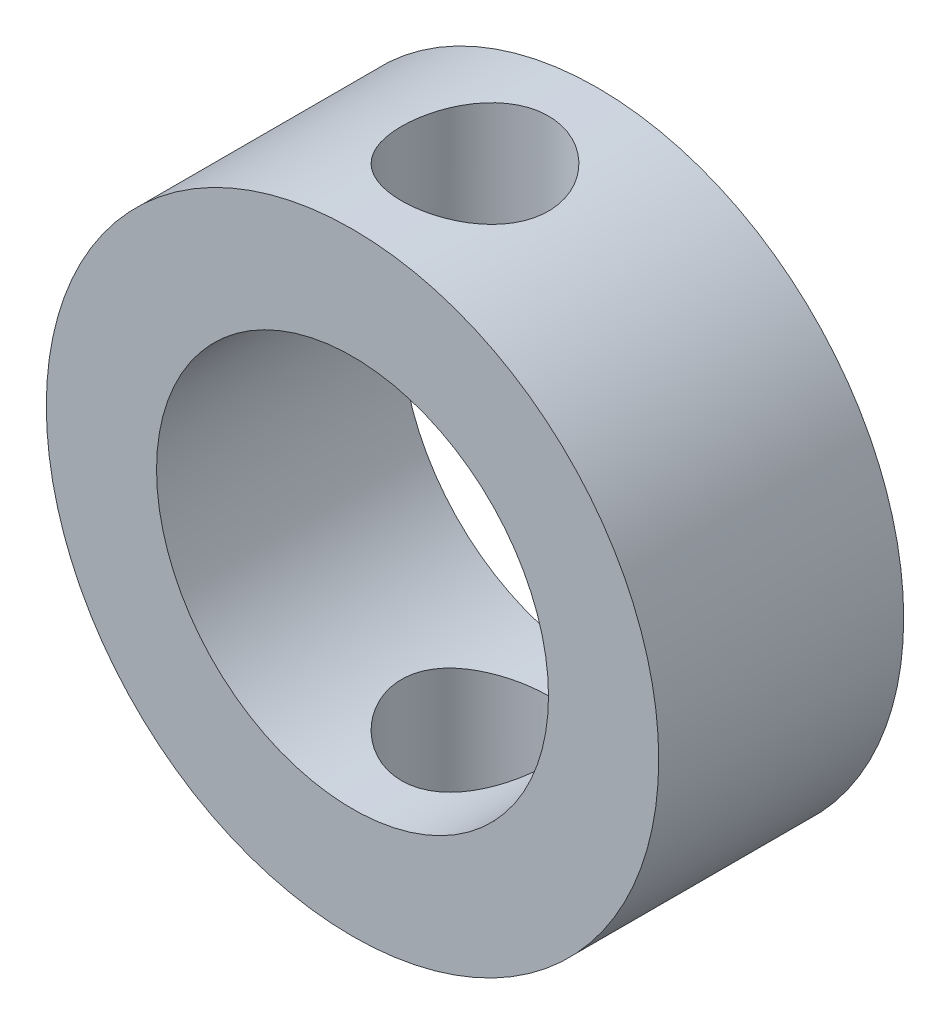
ISO-10303-21;
HEADER;
FILE_DESCRIPTION(('STEP AP214'),'2;1');
FILE_NAME('part.step','',(''),(''),'','','');
FILE_SCHEMA(('AUTOMOTIVE_DESIGN { 1 0 10303 214 1 1 1 1 }'));
ENDSEC;
DATA;
#1=APPLICATION_CONTEXT('core data for automotive mechanical design processes');
#2=APPLICATION_PROTOCOL_DEFINITION('international standard','automotive_design',2000,#1);
#3=PRODUCT_CONTEXT('',#1,'mechanical');
#4=PRODUCT('Part','Part','',(#3));
#5=PRODUCT_RELATED_PRODUCT_CATEGORY('part','',(#4));
#6=PRODUCT_DEFINITION_FORMATION('','',#4);
#7=PRODUCT_DEFINITION_CONTEXT('part definition',#1,'design');
#8=PRODUCT_DEFINITION('design','',#6,#7);
#9=PRODUCT_DEFINITION_SHAPE('','',#8);
#10=(LENGTH_UNIT() NAMED_UNIT(*) SI_UNIT(.MILLI.,.METRE.));
#11=(NAMED_UNIT(*) PLANE_ANGLE_UNIT() SI_UNIT($,.RADIAN.));
#12=(NAMED_UNIT(*) SI_UNIT($,.STERADIAN.) SOLID_ANGLE_UNIT());
#13=UNCERTAINTY_MEASURE_WITH_UNIT(LENGTH_MEASURE(1.E-05),#10,'distance_accuracy_value','');
#14=(GEOMETRIC_REPRESENTATION_CONTEXT(3) GLOBAL_UNCERTAINTY_ASSIGNED_CONTEXT((#13)) GLOBAL_UNIT_ASSIGNED_CONTEXT((#10,
#11,#12)) REPRESENTATION_CONTEXT('',''));
#15=CARTESIAN_POINT('',(0.,0.,0.));
#16=DIRECTION('',(0.,0.,1.));
#17=DIRECTION('',(1.,0.,0.));
#18=AXIS2_PLACEMENT_3D('',#15,#16,#17);
#19=CARTESIAN_POINT('',(0.,0.,5.));
#20=DIRECTION('',(0.,0.,1.));
#21=DIRECTION('',(1.,0.,0.));
#22=AXIS2_PLACEMENT_3D('',#19,#20,#21);
#23=PLANE('',#22);
#24=CARTESIAN_POINT('',(0.,0.,5.));
#25=DIRECTION('',(0.,0.,1.));
#26=DIRECTION('',(1.,0.,0.));
#27=AXIS2_PLACEMENT_3D('',#24,#25,#26);
#28=CIRCLE('',#27,12.5);
#29=CARTESIAN_POINT('',(12.5,0.,5.));
#30=VERTEX_POINT('',#29);
#31=EDGE_CURVE('E10',#30,#30,#28,.T.);
#32=ORIENTED_EDGE('',*,*,#31,.T.);
#33=EDGE_LOOP('',(#32));
#34=FACE_BOUND('',#33,.T.);
#35=CARTESIAN_POINT('',(0.,0.,5.));
#36=DIRECTION('',(0.,0.,1.));
#37=DIRECTION('',(1.,0.,0.));
#38=AXIS2_PLACEMENT_3D('',#35,#36,#37);
#39=CIRCLE('',#38,8.);
#40=CARTESIAN_POINT('',(8.,0.,5.));
#41=VERTEX_POINT('',#40);
#42=EDGE_CURVE('E49',#41,#41,#39,.T.);
#43=ORIENTED_EDGE('',*,*,#42,.F.);
#44=EDGE_LOOP('',(#43));
#45=FACE_BOUND('',#44,.T.);
#46=ADVANCED_FACE('F31',(#34,#45),#23,.T.);
#47=CARTESIAN_POINT('',(0.,0.,-5.));
#48=DIRECTION('',(0.,0.,1.));
#49=DIRECTION('',(1.,0.,0.));
#50=AXIS2_PLACEMENT_3D('',#47,#48,#49);
#51=PLANE('',#50);
#52=CARTESIAN_POINT('',(0.,0.,-5.));
#53=DIRECTION('',(0.,0.,1.));
#54=DIRECTION('',(1.,0.,0.));
#55=AXIS2_PLACEMENT_3D('',#52,#53,#54);
#56=CIRCLE('',#55,12.5);
#57=CARTESIAN_POINT('',(12.5,0.,-5.));
#58=VERTEX_POINT('',#57);
#59=EDGE_CURVE('E44',#58,#58,#56,.T.);
#60=ORIENTED_EDGE('',*,*,#59,.F.);
#61=EDGE_LOOP('',(#60));
#62=FACE_BOUND('',#61,.T.);
#63=CARTESIAN_POINT('',(0.,0.,-5.));
#64=DIRECTION('',(0.,0.,1.));
#65=DIRECTION('',(1.,0.,0.));
#66=AXIS2_PLACEMENT_3D('',#63,#64,#65);
#67=CIRCLE('',#66,8.);
#68=CARTESIAN_POINT('',(8.,0.,-5.));
#69=VERTEX_POINT('',#68);
#70=EDGE_CURVE('E52',#69,#69,#67,.T.);
#71=ORIENTED_EDGE('',*,*,#70,.T.);
#72=EDGE_LOOP('',(#71));
#73=FACE_BOUND('',#72,.T.);
#74=ADVANCED_FACE('F85',(#62,#73),#51,.F.);
#75=CARTESIAN_POINT('',(0.,0.,5.));
#76=DIRECTION('',(0.,0.,-1.));
#77=DIRECTION('',(-1.,0.,0.));
#78=AXIS2_PLACEMENT_3D('',#75,#76,#77);
#79=CYLINDRICAL_SURFACE('',#78,12.5);
#80=CARTESIAN_POINT('',(0.,-12.5,3.));
#81=CARTESIAN_POINT('',(0.165963929028716,-12.4999970714968,2.99999497592273));
#82=CARTESIAN_POINT('',(0.331985420928068,-12.4966615634859,2.98618158976393));
#83=CARTESIAN_POINT('',(0.65928429097138,-12.4836783946933,2.93136726040462));
#84=CARTESIAN_POINT('',(0.820558683214275,-12.4740268462166,2.89034957200532));
#85=CARTESIAN_POINT('',(1.13358839471402,-12.4494823208195,2.78250766549564));
#86=CARTESIAN_POINT('',(1.28535442324822,-12.4345953702841,2.71571311014241));
#87=CARTESIAN_POINT('',(1.57552517879763,-12.4011725442513,2.55831456355411));
#88=CARTESIAN_POINT('',(1.71392971475166,-12.3826366165873,2.46771023192274));
#89=CARTESIAN_POINT('',(1.97609263393972,-12.3435386014785,2.26343582162447));
#90=CARTESIAN_POINT('',(2.0995595210048,-12.3229472454311,2.14939721895074));
#91=CARTESIAN_POINT('',(2.32581080811943,-12.2822574370147,1.90228113093536));
#92=CARTESIAN_POINT('',(2.42859304624489,-12.2621590363612,1.76920165795905));
#93=CARTESIAN_POINT('',(2.61189993555015,-12.224437969062,1.48555416698254));
#94=CARTESIAN_POINT('',(2.69210377047565,-12.2068525815312,1.33477341624115));
#95=CARTESIAN_POINT('',(2.82591582947333,-12.1765733412448,1.02138016487152));
#96=CARTESIAN_POINT('',(2.87952794169564,-12.1638787734309,0.858769397976845));
#97=CARTESIAN_POINT('',(2.95765058108663,-12.1451184675007,0.529523426731098));
#98=CARTESIAN_POINT('',(2.98268262400616,-12.1389341034343,0.363018878474493));
#99=CARTESIAN_POINT('',(3.00455808879087,-12.1335389605945,0.0280676203572428));
#100=CARTESIAN_POINT('',(3.00140571682399,-12.1343271412568,-0.140378795956921));
#101=CARTESIAN_POINT('',(2.96741912081942,-12.1426811387008,-0.470475966012881));
#102=CARTESIAN_POINT('',(2.93720103400494,-12.1500960921292,-0.632194565189556));
#103=CARTESIAN_POINT('',(2.85092141637189,-12.1706283738785,-0.948197316647835));
#104=CARTESIAN_POINT('',(2.79485817372027,-12.1837460799133,-1.10248097573443));
#105=CARTESIAN_POINT('',(2.65794121231782,-12.2143476734445,-1.40091297808436));
#106=CARTESIAN_POINT('',(2.5768594824696,-12.2318714325758,-1.54495245291669));
#107=CARTESIAN_POINT('',(2.39236688956383,-12.2692875046197,-1.81760450072258));
#108=CARTESIAN_POINT('',(2.28895240342647,-12.2891802016137,-1.94621456528511));
#109=CARTESIAN_POINT('',(2.05951493908847,-12.329732025739,-2.18789357031874));
#110=CARTESIAN_POINT('',(1.93297064389908,-12.3503975788014,-2.30046709906221));
#111=CARTESIAN_POINT('',(1.66255592459691,-12.3896951594929,-2.50288471974638));
#112=CARTESIAN_POINT('',(1.5186850498214,-12.4083271342049,-2.59272822029262));
#113=CARTESIAN_POINT('',(1.21702847718581,-12.4415394956922,-2.74729722061278));
#114=CARTESIAN_POINT('',(1.05920278696054,-12.4561077058019,-2.81194745623779));
#115=CARTESIAN_POINT('',(0.734497606078675,-12.4794620474154,-2.91366507904859));
#116=CARTESIAN_POINT('',(0.567619713387661,-12.4882491958651,-2.95073731762681));
#117=CARTESIAN_POINT('',(0.233787399651664,-12.4989027542709,-2.99550206465204));
#118=CARTESIAN_POINT('',(0.0669284805450077,-12.5009282130753,-3.00386989246157));
#119=CARTESIAN_POINT('',(-0.265804381586629,-12.4982807419474,-2.9928332331491));
#120=CARTESIAN_POINT('',(-0.431678404764953,-12.4936083648176,-2.97343103801277));
#121=CARTESIAN_POINT('',(-0.755422580108847,-12.4781916395217,-2.90796302148362));
#122=CARTESIAN_POINT('',(-0.913370579311303,-12.4675301590363,-2.8622608904262));
#123=CARTESIAN_POINT('',(-1.21935330013476,-12.4413335015664,-2.74590180830473));
#124=CARTESIAN_POINT('',(-1.3673870666415,-12.4257978558334,-2.67524245702189));
#125=CARTESIAN_POINT('',(-1.6520615099557,-12.3911910149582,-2.50963340640215));
#126=CARTESIAN_POINT('',(-1.78847176740355,-12.3720653178033,-2.41429928307563));
#127=CARTESIAN_POINT('',(-2.04359904096632,-12.3324936406987,-2.20254307098659));
#128=CARTESIAN_POINT('',(-2.16231325074337,-12.3120474520734,-2.08611764391922));
#129=CARTESIAN_POINT('',(-2.38142453789941,-12.2715742142771,-1.83235916879145));
#130=CARTESIAN_POINT('',(-2.4813497404737,-12.2515669262668,-1.6946148779179));
#131=CARTESIAN_POINT('',(-2.65666020824081,-12.2147538797452,-1.40390957210327));
#132=CARTESIAN_POINT('',(-2.7320465722335,-12.1979479778962,-1.25094923890653));
#133=CARTESIAN_POINT('',(-2.85558993518171,-12.1696189519335,-0.934987486456012));
#134=CARTESIAN_POINT('',(-2.90390754385905,-12.1580647463107,-0.772051796578772));
#135=CARTESIAN_POINT('',(-2.97238380283979,-12.1415072663683,-0.440053814979306));
#136=CARTESIAN_POINT('',(-2.99254804274991,-12.1365026916888,-0.270992746238225));
#137=CARTESIAN_POINT('',(-3.00387066449353,-12.1337046220624,0.0636707002806006));
#138=CARTESIAN_POINT('',(-2.99578106592266,-12.1357241633848,0.229246496326696));
#139=CARTESIAN_POINT('',(-2.95253345626267,-12.1463176460425,0.556599764223694));
#140=CARTESIAN_POINT('',(-2.91737590900096,-12.1548914750658,0.718377301111357));
#141=CARTESIAN_POINT('',(-2.82138591303537,-12.1775274976748,1.03279755254825));
#142=CARTESIAN_POINT('',(-2.76068402045612,-12.191561756094,1.18548227258375));
#143=CARTESIAN_POINT('',(-2.61543373580582,-12.2235433612686,1.47860441388369));
#144=CARTESIAN_POINT('',(-2.53088229934855,-12.2414912075257,1.61904026858636));
#145=CARTESIAN_POINT('',(-2.33793007708464,-12.279819325529,1.88733700011951));
#146=CARTESIAN_POINT('',(-2.22900267979018,-12.3002478697533,2.01481232309873));
#147=CARTESIAN_POINT('',(-1.99143074773236,-12.3409359831145,2.24991998805192));
#148=CARTESIAN_POINT('',(-1.86278158874234,-12.361195511444,2.35754766321024));
#149=CARTESIAN_POINT('',(-1.5868829988014,-12.3996570299581,2.55160925955475));
#150=CARTESIAN_POINT('',(-1.43936414359402,-12.4178200201219,2.637668405442));
#151=CARTESIAN_POINT('',(-1.13153622828567,-12.4496380610582,2.78362953274789));
#152=CARTESIAN_POINT('',(-0.97123697369122,-12.4632965272855,2.84355134339162));
#153=CARTESIAN_POINT('',(-0.675887025694765,-12.4824059901497,2.92603862513779));
#154=CARTESIAN_POINT('',(-0.542312066268421,-12.4889599449579,2.9537166157857));
#155=CARTESIAN_POINT('',(-0.272504227478248,-12.4977580149525,2.99069878085188));
#156=CARTESIAN_POINT('',(-0.136271517915776,-12.5000024045682,3.00000412522552));
#157=CARTESIAN_POINT('',(0.,-12.5,3.));
#158=B_SPLINE_CURVE_WITH_KNOTS('',3,(#80,#81,#82,#83,#84,#85,#86,#87,#88,#89,#90,#91,#92,#93,
#94,#95,#96,#97,#98,#99,#100,#101,#102,#103,#104,#105,#106,#107,#108,#109,#110,#111,#112,#113,
#114,#115,#116,#117,#118,#119,#120,#121,#122,#123,#124,#125,#126,#127,#128,#129,#130,#131,#132,
#133,#134,#135,#136,#137,#138,#139,#140,#141,#142,#143,#144,#145,#146,#147,#148,#149,#150,#151,
#152,#153,#154,#155,#156,#157),.UNSPECIFIED.,.T.,.F.,(4,2,2,2,2,2,2,2,2,2,2,2,2,2,2,2,2,2,2,2,2,
2,2,2,2,2,2,2,2,2,2,2,2,2,2,2,2,2,4),(0.,0.497392599366679,0.995091645758824,1.49221966408501,
1.98935478998519,2.49500570148357,3.00070943533306,3.51327262050849,4.02576083835037,
4.52873995359111,5.03164400680465,5.52338274964839,6.01515406709138,6.51154667521171,
7.00801987450003,7.51749958381935,8.02699254752171,8.53799614678203,9.04890983140415,
9.54771776810826,10.0464845383097,10.5385143736981,11.0305915421211,11.5308523313794,
12.031192370573,12.5427824523192,13.0543496229377,13.5628484119093,14.0712462285018,
14.5662165454702,15.0611783809799,15.5536406351284,16.0461657803879,16.5505844610431,
17.0551215958269,17.5678974206352,18.0802835459069,18.4887142303991,18.897118905514),.UNSPECIFIED.);
#159=CARTESIAN_POINT('',(0.,-12.5,3.));
#160=VERTEX_POINT('',#159);
#161=EDGE_CURVE('E75',#160,#160,#158,.T.);
#162=ORIENTED_EDGE('',*,*,#161,.T.);
#163=EDGE_LOOP('',(#162));
#164=FACE_BOUND('',#163,.T.);
#165=CARTESIAN_POINT('',(0.,12.5,3.));
#166=CARTESIAN_POINT('',(-0.165963929028716,12.4999970714968,2.99999497592273));
#167=CARTESIAN_POINT('',(-0.331985420928068,12.4966615634859,2.98618158976393));
#168=CARTESIAN_POINT('',(-0.65928429097138,12.4836783946933,2.93136726040462));
#169=CARTESIAN_POINT('',(-0.820558683214275,12.4740268462166,2.89034957200532));
#170=CARTESIAN_POINT('',(-1.13358839471402,12.4494823208195,2.78250766549564));
#171=CARTESIAN_POINT('',(-1.28535442324822,12.4345953702841,2.71571311014241));
#172=CARTESIAN_POINT('',(-1.57552517879763,12.4011725442513,2.55831456355411));
#173=CARTESIAN_POINT('',(-1.71392971475166,12.3826366165873,2.46771023192274));
#174=CARTESIAN_POINT('',(-1.97609263393972,12.3435386014785,2.26343582162447));
#175=CARTESIAN_POINT('',(-2.0995595210048,12.3229472454311,2.14939721895074));
#176=CARTESIAN_POINT('',(-2.32581080811943,12.2822574370147,1.90228113093536));
#177=CARTESIAN_POINT('',(-2.42859304624489,12.2621590363612,1.76920165795905));
#178=CARTESIAN_POINT('',(-2.61189993555015,12.224437969062,1.48555416698254));
#179=CARTESIAN_POINT('',(-2.69210377047565,12.2068525815312,1.33477341624115));
#180=CARTESIAN_POINT('',(-2.82591582947333,12.1765733412448,1.02138016487152));
#181=CARTESIAN_POINT('',(-2.87952794169564,12.1638787734309,0.858769397976845));
#182=CARTESIAN_POINT('',(-2.95765058108663,12.1451184675007,0.529523426731098));
#183=CARTESIAN_POINT('',(-2.98268262400616,12.1389341034343,0.363018878474493));
#184=CARTESIAN_POINT('',(-3.00455808879087,12.1335389605945,0.0280676203572428));
#185=CARTESIAN_POINT('',(-3.00140571682399,12.1343271412568,-0.140378795956921));
#186=CARTESIAN_POINT('',(-2.96741912081942,12.1426811387008,-0.470475966012881));
#187=CARTESIAN_POINT('',(-2.93720103400494,12.1500960921292,-0.632194565189556));
#188=CARTESIAN_POINT('',(-2.85092141637189,12.1706283738785,-0.948197316647835));
#189=CARTESIAN_POINT('',(-2.79485817372027,12.1837460799133,-1.10248097573443));
#190=CARTESIAN_POINT('',(-2.65794121231782,12.2143476734445,-1.40091297808436));
#191=CARTESIAN_POINT('',(-2.5768594824696,12.2318714325758,-1.54495245291669));
#192=CARTESIAN_POINT('',(-2.39236688956383,12.2692875046197,-1.81760450072258));
#193=CARTESIAN_POINT('',(-2.28895240342647,12.2891802016137,-1.94621456528511));
#194=CARTESIAN_POINT('',(-2.05951493908847,12.329732025739,-2.18789357031874));
#195=CARTESIAN_POINT('',(-1.93297064389908,12.3503975788014,-2.30046709906221));
#196=CARTESIAN_POINT('',(-1.66255592459691,12.3896951594929,-2.50288471974638));
#197=CARTESIAN_POINT('',(-1.5186850498214,12.4083271342049,-2.59272822029262));
#198=CARTESIAN_POINT('',(-1.21702847718581,12.4415394956922,-2.74729722061278));
#199=CARTESIAN_POINT('',(-1.05920278696054,12.4561077058019,-2.81194745623779));
#200=CARTESIAN_POINT('',(-0.734497606078675,12.4794620474154,-2.91366507904859));
#201=CARTESIAN_POINT('',(-0.567619713387661,12.4882491958651,-2.95073731762681));
#202=CARTESIAN_POINT('',(-0.233787399651664,12.4989027542709,-2.99550206465204));
#203=CARTESIAN_POINT('',(-0.0669284805450077,12.5009282130753,-3.00386989246157));
#204=CARTESIAN_POINT('',(0.265804381586629,12.4982807419474,-2.9928332331491));
#205=CARTESIAN_POINT('',(0.431678404764953,12.4936083648176,-2.97343103801277));
#206=CARTESIAN_POINT('',(0.755422580108847,12.4781916395217,-2.90796302148362));
#207=CARTESIAN_POINT('',(0.913370579311303,12.4675301590363,-2.8622608904262));
#208=CARTESIAN_POINT('',(1.21935330013476,12.4413335015664,-2.74590180830473));
#209=CARTESIAN_POINT('',(1.3673870666415,12.4257978558334,-2.67524245702189));
#210=CARTESIAN_POINT('',(1.6520615099557,12.3911910149582,-2.50963340640215));
#211=CARTESIAN_POINT('',(1.78847176740355,12.3720653178033,-2.41429928307563));
#212=CARTESIAN_POINT('',(2.04359904096632,12.3324936406987,-2.20254307098659));
#213=CARTESIAN_POINT('',(2.16231325074337,12.3120474520734,-2.08611764391922));
#214=CARTESIAN_POINT('',(2.38142453789941,12.2715742142771,-1.83235916879145));
#215=CARTESIAN_POINT('',(2.4813497404737,12.2515669262668,-1.6946148779179));
#216=CARTESIAN_POINT('',(2.65666020824081,12.2147538797452,-1.40390957210327));
#217=CARTESIAN_POINT('',(2.7320465722335,12.1979479778962,-1.25094923890653));
#218=CARTESIAN_POINT('',(2.85558993518171,12.1696189519335,-0.934987486456012));
#219=CARTESIAN_POINT('',(2.90390754385905,12.1580647463107,-0.772051796578772));
#220=CARTESIAN_POINT('',(2.97238380283979,12.1415072663683,-0.440053814979306));
#221=CARTESIAN_POINT('',(2.99254804274991,12.1365026916888,-0.270992746238225));
#222=CARTESIAN_POINT('',(3.00387066449353,12.1337046220624,0.0636707002806006));
#223=CARTESIAN_POINT('',(2.99578106592266,12.1357241633848,0.229246496326696));
#224=CARTESIAN_POINT('',(2.95253345626267,12.1463176460425,0.556599764223694));
#225=CARTESIAN_POINT('',(2.91737590900096,12.1548914750658,0.718377301111357));
#226=CARTESIAN_POINT('',(2.82138591303537,12.1775274976748,1.03279755254825));
#227=CARTESIAN_POINT('',(2.76068402045612,12.191561756094,1.18548227258375));
#228=CARTESIAN_POINT('',(2.61543373580582,12.2235433612686,1.47860441388369));
#229=CARTESIAN_POINT('',(2.53088229934855,12.2414912075257,1.61904026858636));
#230=CARTESIAN_POINT('',(2.33793007708464,12.279819325529,1.88733700011951));
#231=CARTESIAN_POINT('',(2.22900267979018,12.3002478697533,2.01481232309873));
#232=CARTESIAN_POINT('',(1.99143074773236,12.3409359831145,2.24991998805192));
#233=CARTESIAN_POINT('',(1.86278158874234,12.361195511444,2.35754766321024));
#234=CARTESIAN_POINT('',(1.5868829988014,12.3996570299581,2.55160925955475));
#235=CARTESIAN_POINT('',(1.43936414359402,12.4178200201219,2.637668405442));
#236=CARTESIAN_POINT('',(1.13153622828567,12.4496380610582,2.78362953274789));
#237=CARTESIAN_POINT('',(0.97123697369122,12.4632965272855,2.84355134339162));
#238=CARTESIAN_POINT('',(0.675887025694765,12.4824059901497,2.92603862513779));
#239=CARTESIAN_POINT('',(0.542312066268421,12.4889599449579,2.9537166157857));
#240=CARTESIAN_POINT('',(0.272504227478248,12.4977580149525,2.99069878085188));
#241=CARTESIAN_POINT('',(0.136271517915776,12.5000024045682,3.00000412522552));
#242=CARTESIAN_POINT('',(0.,12.5,3.));
#243=B_SPLINE_CURVE_WITH_KNOTS('',3,(#165,#166,#167,#168,#169,#170,#171,#172,#173,#174,#175,
#176,#177,#178,#179,#180,#181,#182,#183,#184,#185,#186,#187,#188,#189,#190,#191,#192,#193,#194,
#195,#196,#197,#198,#199,#200,#201,#202,#203,#204,#205,#206,#207,#208,#209,#210,#211,#212,#213,
#214,#215,#216,#217,#218,#219,#220,#221,#222,#223,#224,#225,#226,#227,#228,#229,#230,#231,#232,
#233,#234,#235,#236,#237,#238,#239,#240,#241,#242),.UNSPECIFIED.,.T.,.F.,(4,2,2,2,2,2,2,2,2,2,2,
2,2,2,2,2,2,2,2,2,2,2,2,2,2,2,2,2,2,2,2,2,2,2,2,2,2,2,4),(0.,0.497392599366679,
0.995091645758824,1.49221966408501,1.98935478998519,2.49500570148357,3.00070943533306,
3.51327262050849,4.02576083835037,4.52873995359111,5.03164400680465,5.52338274964839,
6.01515406709138,6.51154667521171,7.00801987450003,7.51749958381935,8.02699254752171,
8.53799614678203,9.04890983140415,9.54771776810826,10.0464845383097,10.5385143736981,
11.0305915421211,11.5308523313794,12.031192370573,12.5427824523192,13.0543496229377,
13.5628484119093,14.0712462285018,14.5662165454702,15.0611783809799,15.5536406351284,
16.0461657803879,16.5505844610431,17.0551215958269,17.5678974206352,18.0802835459069,
18.4887142303991,18.897118905514),.UNSPECIFIED.);
#244=CARTESIAN_POINT('',(0.,12.5,3.));
#245=VERTEX_POINT('',#244);
#246=EDGE_CURVE('E71',#245,#245,#243,.T.);
#247=ORIENTED_EDGE('',*,*,#246,.T.);
#248=EDGE_LOOP('',(#247));
#249=FACE_BOUND('',#248,.T.);
#250=ORIENTED_EDGE('',*,*,#31,.F.);
#251=EDGE_LOOP('',(#250));
#252=FACE_BOUND('',#251,.T.);
#253=ORIENTED_EDGE('',*,*,#59,.T.);
#254=EDGE_LOOP('',(#253));
#255=FACE_BOUND('',#254,.T.);
#256=ADVANCED_FACE('F33',(#164,#249,#252,#255),#79,.T.);
#257=CARTESIAN_POINT('',(0.,0.,5.));
#258=DIRECTION('',(0.,0.,-1.));
#259=DIRECTION('',(-1.,0.,0.));
#260=AXIS2_PLACEMENT_3D('',#257,#258,#259);
#261=CYLINDRICAL_SURFACE('',#260,8.);
#262=CARTESIAN_POINT('',(0.,-8.,3.));
#263=CARTESIAN_POINT('',(0.162470117875706,-8.00000434912302,3.00000580460622));
#264=CARTESIAN_POINT('',(0.324900483563584,-7.99500758566368,2.98676047950323));
#265=CARTESIAN_POINT('',(0.644906904704722,-7.97557392013855,2.93434360946014));
#266=CARTESIAN_POINT('',(0.802483655975232,-7.96113837787987,2.89517579905887));
#267=CARTESIAN_POINT('',(1.10812156998176,-7.92437664783088,2.79249399645648));
#268=CARTESIAN_POINT('',(1.25620044832455,-7.90206568698877,2.72902696635642));
#269=CARTESIAN_POINT('',(1.53959862032051,-7.85177535530709,2.57978717396836));
#270=CARTESIAN_POINT('',(1.67491447835576,-7.82379446455107,2.4940084289117));
#271=CARTESIAN_POINT('',(1.93469283409165,-7.76372493942421,2.29877493785817));
#272=CARTESIAN_POINT('',(2.05854146030237,-7.73152005167087,2.18853947548116));
#273=CARTESIAN_POINT('',(2.28648842948728,-7.66720441742698,1.94917913068235));
#274=CARTESIAN_POINT('',(2.39058072718411,-7.63509370270232,1.82004848782437));
#275=CARTESIAN_POINT('',(2.57996404431964,-7.5732494123529,1.54056506495346));
#276=CARTESIAN_POINT('',(2.66438786391496,-7.5436529764098,1.3895912669079));
#277=CARTESIAN_POINT('',(2.80637292668193,-7.49199720475523,1.07430329166342));
#278=CARTESIAN_POINT('',(2.86394489922567,-7.46993485954215,0.909994473691523));
#279=CARTESIAN_POINT('',(2.94816862035013,-7.43708825645919,0.579766519481941));
#280=CARTESIAN_POINT('',(2.97599186436803,-7.42587848693063,0.414189923123046));
#281=CARTESIAN_POINT('',(3.00359113063608,-7.41476122931038,0.0803676840183833));
#282=CARTESIAN_POINT('',(3.00337873606425,-7.41484907350686,-0.0878768277263325));
#283=CARTESIAN_POINT('',(2.97580859218857,-7.42595023233986,-0.411539050457117));
#284=CARTESIAN_POINT('',(2.95007617013711,-7.43630937632964,-0.567121812185203));
#285=CARTESIAN_POINT('',(2.87488335732475,-7.46569876010067,-0.871574300902489));
#286=CARTESIAN_POINT('',(2.82541939325577,-7.48473030568195,-1.020443013249));
#287=CARTESIAN_POINT('',(2.70327497145115,-7.52971404410467,-1.31055413542651));
#288=CARTESIAN_POINT('',(2.63017297474552,-7.55579035984378,-1.45159897223456));
#289=CARTESIAN_POINT('',(2.46312147525044,-7.61188420270589,-1.71989147518999));
#290=CARTESIAN_POINT('',(2.36916477457696,-7.64190308912094,-1.84713435504162));
#291=CARTESIAN_POINT('',(2.15563561533201,-7.70496077720597,-2.09320732729939));
#292=CARTESIAN_POINT('',(2.03476597433939,-7.73806694911977,-2.21089728149555));
#293=CARTESIAN_POINT('',(1.77462518163776,-7.80183456327535,-2.42467593241223));
#294=CARTESIAN_POINT('',(1.63535120699465,-7.83249562931732,-2.52076130921152));
#295=CARTESIAN_POINT('',(1.33944687398491,-7.88852789618334,-2.68986079412487));
#296=CARTESIAN_POINT('',(1.18258142768946,-7.91380996519278,-2.76249516244208));
#297=CARTESIAN_POINT('',(0.857673701049145,-7.95557436653878,-2.87996520854013));
#298=CARTESIAN_POINT('',(0.689636421691529,-7.97206060682974,-2.92481323312225));
#299=CARTESIAN_POINT('',(0.356750486297335,-7.99368886456142,-2.98324557508387));
#300=CARTESIAN_POINT('',(0.192207239124419,-7.99938738051376,-2.99836521276502));
#301=CARTESIAN_POINT('',(-0.137144950510051,-8.00051787400248,-3.00138212779984));
#302=CARTESIAN_POINT('',(-0.301953825966747,-7.99595212773726,-2.98928544063355));
#303=CARTESIAN_POINT('',(-0.620524097123719,-7.97743419545287,-2.93937991538266));
#304=CARTESIAN_POINT('',(-0.774466656014673,-7.9638494192461,-2.90257691252583));
#305=CARTESIAN_POINT('',(-1.07388350991444,-7.92902954183434,-2.80562785490536));
#306=CARTESIAN_POINT('',(-1.21935670069507,-7.9077934456406,-2.74547876410393));
#307=CARTESIAN_POINT('',(-1.50249553022031,-7.85899248815363,-2.60162717512105));
#308=CARTESIAN_POINT('',(-1.63980616711559,-7.83126000418697,-2.51728454155323));
#309=CARTESIAN_POINT('',(-1.89878542345325,-7.77253343129328,-2.32816379365689));
#310=CARTESIAN_POINT('',(-2.0204482405409,-7.74153814019032,-2.2233781349097));
#311=CARTESIAN_POINT('',(-2.25206159748909,-7.67746658981979,-1.98919175575145));
#312=CARTESIAN_POINT('',(-2.36092308247137,-7.64437393007459,-1.8587156344546));
#313=CARTESIAN_POINT('',(-2.55542100063807,-7.58157631493707,-1.58069723058469));
#314=CARTESIAN_POINT('',(-2.64105534829037,-7.55187166388799,-1.433153417223));
#315=CARTESIAN_POINT('',(-2.78675547037995,-7.49933659644927,-1.12396802645537));
#316=CARTESIAN_POINT('',(-2.84671370893836,-7.47653520656987,-0.962270508179128));
#317=CARTESIAN_POINT('',(-2.93815766933778,-7.4410806578201,-0.629980472624355));
#318=CARTESIAN_POINT('',(-2.9696610061107,-7.42842122114981,-0.459393527603753));
#319=CARTESIAN_POINT('',(-3.00172694195678,-7.41551789585147,-0.125967680917771));
#320=CARTESIAN_POINT('',(-3.00414662991675,-7.41452889046682,0.0366652634337717));
#321=CARTESIAN_POINT('',(-2.98273431283185,-7.42316825490584,0.359890632552331));
#322=CARTESIAN_POINT('',(-2.95890479700247,-7.43279561797798,0.520483249343167));
#323=CARTESIAN_POINT('',(-2.88711631260483,-7.46096283170865,0.830094453433105));
#324=CARTESIAN_POINT('',(-2.83991596633048,-7.47922170753326,0.979316692490691));
#325=CARTESIAN_POINT('',(-2.72339393559839,-7.52243096595689,1.26781101698884));
#326=CARTESIAN_POINT('',(-2.65406665889889,-7.54738303990429,1.40708057614029));
#327=CARTESIAN_POINT('',(-2.49104151876307,-7.60279447807929,1.67965357939526));
#328=CARTESIAN_POINT('',(-2.3962566560602,-7.63347396881928,1.81226159359982));
#329=CARTESIAN_POINT('',(-2.18668971459812,-7.69612493514355,2.06028312194241));
#330=CARTESIAN_POINT('',(-2.07190128025616,-7.7280968188629,2.17569114957351));
#331=CARTESIAN_POINT('',(-1.81816079356924,-7.79180849219762,2.39240391164368));
#332=CARTESIAN_POINT('',(-1.67823728842598,-7.82344209801289,2.49260750686935));
#333=CARTESIAN_POINT('',(-1.38242644640164,-7.88109028914061,2.66804531055311));
#334=CARTESIAN_POINT('',(-1.22653786818124,-7.90710443703118,2.74327757547274));
#335=CARTESIAN_POINT('',(-0.895998164004623,-7.9514858521336,2.86875365809666));
#336=CARTESIAN_POINT('',(-0.720826844468416,-7.96947314316712,2.91777412920379));
#337=CARTESIAN_POINT('',(-0.363751467212765,-7.99372484359173,2.98338591984136));
#338=CARTESIAN_POINT('',(-0.181850832729718,-7.99999513207934,2.99999350297465));
#339=CARTESIAN_POINT('',(0.,-8.,3.));
#340=B_SPLINE_CURVE_WITH_KNOTS('',3,(#262,#263,#264,#265,#266,#267,#268,#269,#270,#271,#272,
#273,#274,#275,#276,#277,#278,#279,#280,#281,#282,#283,#284,#285,#286,#287,#288,#289,#290,#291,
#292,#293,#294,#295,#296,#297,#298,#299,#300,#301,#302,#303,#304,#305,#306,#307,#308,#309,#310,
#311,#312,#313,#314,#315,#316,#317,#318,#319,#320,#321,#322,#323,#324,#325,#326,#327,#328,#329,
#330,#331,#332,#333,#334,#335,#336,#337,#338,#339),.UNSPECIFIED.,.T.,.F.,(4,2,2,2,2,2,2,2,2,2,2,
2,2,2,2,2,2,2,2,2,2,2,2,2,2,2,2,2,2,2,2,2,2,2,2,2,2,2,4),(0.,0.48673960312112,0.973409099060921,
1.45914273842715,1.94500675921898,2.44947237165431,2.95409209851243,3.47793349003317,
4.00156538704268,4.50371748833803,5.00566212159414,5.47756690242935,5.94954276126852,
6.43044816779711,6.91151981494191,7.42492306677299,7.93840515815806,8.45982750577824,
8.98101799403365,9.47450039277525,9.96787336786715,10.4422887585335,10.9167658651458,
11.4051844372487,11.8937836004541,12.4107303891699,12.9277235784596,13.4468613346008,
13.9656774991869,14.4511752696618,14.9366270042819,15.4072628485874,15.8780177331869,
16.3734494377422,16.869038839998,17.3914465931375,17.9138949961588,18.4589703006976,
19.0037720359793),.UNSPECIFIED.);
#341=CARTESIAN_POINT('',(0.,-8.,3.));
#342=VERTEX_POINT('',#341);
#343=EDGE_CURVE('E36',#342,#342,#340,.T.);
#344=ORIENTED_EDGE('',*,*,#343,.F.);
#345=EDGE_LOOP('',(#344));
#346=FACE_BOUND('',#345,.T.);
#347=CARTESIAN_POINT('',(0.,8.,3.));
#348=CARTESIAN_POINT('',(-0.162470117875706,8.00000434912302,3.00000580460622));
#349=CARTESIAN_POINT('',(-0.324900483563584,7.99500758566368,2.98676047950323));
#350=CARTESIAN_POINT('',(-0.644906904704722,7.97557392013855,2.93434360946014));
#351=CARTESIAN_POINT('',(-0.802483655975232,7.96113837787987,2.89517579905887));
#352=CARTESIAN_POINT('',(-1.10812156998176,7.92437664783088,2.79249399645648));
#353=CARTESIAN_POINT('',(-1.25620044832455,7.90206568698877,2.72902696635642));
#354=CARTESIAN_POINT('',(-1.53959862032051,7.85177535530709,2.57978717396836));
#355=CARTESIAN_POINT('',(-1.67491447835576,7.82379446455107,2.4940084289117));
#356=CARTESIAN_POINT('',(-1.93469283409165,7.76372493942421,2.29877493785817));
#357=CARTESIAN_POINT('',(-2.05854146030237,7.73152005167087,2.18853947548116));
#358=CARTESIAN_POINT('',(-2.28648842948728,7.66720441742698,1.94917913068235));
#359=CARTESIAN_POINT('',(-2.39058072718411,7.63509370270232,1.82004848782437));
#360=CARTESIAN_POINT('',(-2.57996404431964,7.5732494123529,1.54056506495346));
#361=CARTESIAN_POINT('',(-2.66438786391496,7.5436529764098,1.3895912669079));
#362=CARTESIAN_POINT('',(-2.80637292668193,7.49199720475523,1.07430329166342));
#363=CARTESIAN_POINT('',(-2.86394489922567,7.46993485954215,0.909994473691523));
#364=CARTESIAN_POINT('',(-2.94816862035013,7.43708825645919,0.579766519481941));
#365=CARTESIAN_POINT('',(-2.97599186436803,7.42587848693063,0.414189923123046));
#366=CARTESIAN_POINT('',(-3.00359113063608,7.41476122931038,0.0803676840183833));
#367=CARTESIAN_POINT('',(-3.00337873606425,7.41484907350686,-0.0878768277263325));
#368=CARTESIAN_POINT('',(-2.97580859218857,7.42595023233986,-0.411539050457117));
#369=CARTESIAN_POINT('',(-2.95007617013711,7.43630937632964,-0.567121812185203));
#370=CARTESIAN_POINT('',(-2.87488335732475,7.46569876010067,-0.871574300902489));
#371=CARTESIAN_POINT('',(-2.82541939325577,7.48473030568195,-1.020443013249));
#372=CARTESIAN_POINT('',(-2.70327497145115,7.52971404410467,-1.31055413542651));
#373=CARTESIAN_POINT('',(-2.63017297474552,7.55579035984378,-1.45159897223456));
#374=CARTESIAN_POINT('',(-2.46312147525044,7.61188420270589,-1.71989147518999));
#375=CARTESIAN_POINT('',(-2.36916477457696,7.64190308912094,-1.84713435504162));
#376=CARTESIAN_POINT('',(-2.15563561533201,7.70496077720597,-2.09320732729939));
#377=CARTESIAN_POINT('',(-2.03476597433939,7.73806694911977,-2.21089728149555));
#378=CARTESIAN_POINT('',(-1.77462518163776,7.80183456327535,-2.42467593241223));
#379=CARTESIAN_POINT('',(-1.63535120699465,7.83249562931732,-2.52076130921152));
#380=CARTESIAN_POINT('',(-1.33944687398491,7.88852789618334,-2.68986079412487));
#381=CARTESIAN_POINT('',(-1.18258142768946,7.91380996519278,-2.76249516244208));
#382=CARTESIAN_POINT('',(-0.857673701049145,7.95557436653878,-2.87996520854013));
#383=CARTESIAN_POINT('',(-0.689636421691529,7.97206060682974,-2.92481323312225));
#384=CARTESIAN_POINT('',(-0.356750486297335,7.99368886456142,-2.98324557508387));
#385=CARTESIAN_POINT('',(-0.192207239124419,7.99938738051376,-2.99836521276502));
#386=CARTESIAN_POINT('',(0.137144950510051,8.00051787400248,-3.00138212779984));
#387=CARTESIAN_POINT('',(0.301953825966747,7.99595212773726,-2.98928544063355));
#388=CARTESIAN_POINT('',(0.620524097123719,7.97743419545287,-2.93937991538266));
#389=CARTESIAN_POINT('',(0.774466656014673,7.9638494192461,-2.90257691252583));
#390=CARTESIAN_POINT('',(1.07388350991444,7.92902954183434,-2.80562785490536));
#391=CARTESIAN_POINT('',(1.21935670069507,7.9077934456406,-2.74547876410393));
#392=CARTESIAN_POINT('',(1.50249553022031,7.85899248815363,-2.60162717512105));
#393=CARTESIAN_POINT('',(1.63980616711559,7.83126000418697,-2.51728454155323));
#394=CARTESIAN_POINT('',(1.89878542345325,7.77253343129328,-2.32816379365689));
#395=CARTESIAN_POINT('',(2.0204482405409,7.74153814019032,-2.2233781349097));
#396=CARTESIAN_POINT('',(2.25206159748909,7.67746658981979,-1.98919175575145));
#397=CARTESIAN_POINT('',(2.36092308247137,7.64437393007459,-1.8587156344546));
#398=CARTESIAN_POINT('',(2.55542100063807,7.58157631493707,-1.58069723058469));
#399=CARTESIAN_POINT('',(2.64105534829037,7.55187166388799,-1.433153417223));
#400=CARTESIAN_POINT('',(2.78675547037995,7.49933659644927,-1.12396802645537));
#401=CARTESIAN_POINT('',(2.84671370893836,7.47653520656987,-0.962270508179128));
#402=CARTESIAN_POINT('',(2.93815766933778,7.4410806578201,-0.629980472624355));
#403=CARTESIAN_POINT('',(2.9696610061107,7.42842122114981,-0.459393527603753));
#404=CARTESIAN_POINT('',(3.00172694195678,7.41551789585147,-0.125967680917771));
#405=CARTESIAN_POINT('',(3.00414662991675,7.41452889046682,0.0366652634337717));
#406=CARTESIAN_POINT('',(2.98273431283185,7.42316825490584,0.359890632552331));
#407=CARTESIAN_POINT('',(2.95890479700247,7.43279561797798,0.520483249343167));
#408=CARTESIAN_POINT('',(2.88711631260483,7.46096283170865,0.830094453433105));
#409=CARTESIAN_POINT('',(2.83991596633048,7.47922170753326,0.979316692490691));
#410=CARTESIAN_POINT('',(2.72339393559839,7.52243096595689,1.26781101698884));
#411=CARTESIAN_POINT('',(2.65406665889889,7.54738303990429,1.40708057614029));
#412=CARTESIAN_POINT('',(2.49104151876307,7.60279447807929,1.67965357939526));
#413=CARTESIAN_POINT('',(2.3962566560602,7.63347396881928,1.81226159359982));
#414=CARTESIAN_POINT('',(2.18668971459812,7.69612493514355,2.06028312194241));
#415=CARTESIAN_POINT('',(2.07190128025616,7.7280968188629,2.17569114957351));
#416=CARTESIAN_POINT('',(1.81816079356924,7.79180849219762,2.39240391164368));
#417=CARTESIAN_POINT('',(1.67823728842598,7.82344209801289,2.49260750686935));
#418=CARTESIAN_POINT('',(1.38242644640164,7.88109028914061,2.66804531055311));
#419=CARTESIAN_POINT('',(1.22653786818124,7.90710443703118,2.74327757547274));
#420=CARTESIAN_POINT('',(0.895998164004623,7.9514858521336,2.86875365809666));
#421=CARTESIAN_POINT('',(0.720826844468416,7.96947314316712,2.91777412920379));
#422=CARTESIAN_POINT('',(0.363751467212765,7.99372484359173,2.98338591984136));
#423=CARTESIAN_POINT('',(0.181850832729718,7.99999513207934,2.99999350297465));
#424=CARTESIAN_POINT('',(0.,8.,3.));
#425=B_SPLINE_CURVE_WITH_KNOTS('',3,(#347,#348,#349,#350,#351,#352,#353,#354,#355,#356,#357,
#358,#359,#360,#361,#362,#363,#364,#365,#366,#367,#368,#369,#370,#371,#372,#373,#374,#375,#376,
#377,#378,#379,#380,#381,#382,#383,#384,#385,#386,#387,#388,#389,#390,#391,#392,#393,#394,#395,
#396,#397,#398,#399,#400,#401,#402,#403,#404,#405,#406,#407,#408,#409,#410,#411,#412,#413,#414,
#415,#416,#417,#418,#419,#420,#421,#422,#423,#424),.UNSPECIFIED.,.T.,.F.,(4,2,2,2,2,2,2,2,2,2,2,
2,2,2,2,2,2,2,2,2,2,2,2,2,2,2,2,2,2,2,2,2,2,2,2,2,2,2,4),(0.,0.48673960312112,0.973409099060921,
1.45914273842715,1.94500675921898,2.44947237165431,2.95409209851243,3.47793349003317,
4.00156538704268,4.50371748833803,5.00566212159414,5.47756690242935,5.94954276126852,
6.43044816779711,6.91151981494191,7.42492306677299,7.93840515815806,8.45982750577824,
8.98101799403365,9.47450039277525,9.96787336786715,10.4422887585335,10.9167658651458,
11.4051844372487,11.8937836004541,12.4107303891699,12.9277235784596,13.4468613346008,
13.9656774991869,14.4511752696618,14.9366270042819,15.4072628485874,15.8780177331869,
16.3734494377422,16.869038839998,17.3914465931375,17.9138949961588,18.4589703006976,
19.0037720359793),.UNSPECIFIED.);
#426=CARTESIAN_POINT('',(0.,8.,3.));
#427=VERTEX_POINT('',#426);
#428=EDGE_CURVE('E54',#427,#427,#425,.T.);
#429=ORIENTED_EDGE('',*,*,#428,.F.);
#430=EDGE_LOOP('',(#429));
#431=FACE_BOUND('',#430,.T.);
#432=ORIENTED_EDGE('',*,*,#42,.T.);
#433=EDGE_LOOP('',(#432));
#434=FACE_BOUND('',#433,.T.);
#435=ORIENTED_EDGE('',*,*,#70,.F.);
#436=EDGE_LOOP('',(#435));
#437=FACE_BOUND('',#436,.T.);
#438=ADVANCED_FACE('F58',(#346,#431,#434,#437),#261,.F.);
#439=CARTESIAN_POINT('',(0.,-25.,0.));
#440=DIRECTION('',(0.,1.,0.));
#441=DIRECTION('',(0.,0.,1.));
#442=AXIS2_PLACEMENT_3D('',#439,#440,#441);
#443=CYLINDRICAL_SURFACE('',#442,3.);
#444=ORIENTED_EDGE('',*,*,#428,.T.);
#445=EDGE_LOOP('',(#444));
#446=FACE_BOUND('',#445,.T.);
#447=ORIENTED_EDGE('',*,*,#246,.F.);
#448=EDGE_LOOP('',(#447));
#449=FACE_BOUND('',#448,.T.);
#450=ADVANCED_FACE('F64',(#446,#449),#443,.F.);
#451=ORIENTED_EDGE('',*,*,#343,.T.);
#452=EDGE_LOOP('',(#451));
#453=FACE_BOUND('',#452,.T.);
#454=ORIENTED_EDGE('',*,*,#161,.F.);
#455=EDGE_LOOP('',(#454));
#456=FACE_BOUND('',#455,.T.);
#457=ADVANCED_FACE('F61',(#453,#456),#443,.F.);
#458=CLOSED_SHELL('',(#46,#74,#256,#438,#450,#457));
#459=MANIFOLD_SOLID_BREP('B2',#458);
#460=ADVANCED_BREP_SHAPE_REPRESENTATION('',(#18,#459),#14);
#461=SHAPE_DEFINITION_REPRESENTATION(#9,#460);
ENDSEC;
END-ISO-10303-21;
